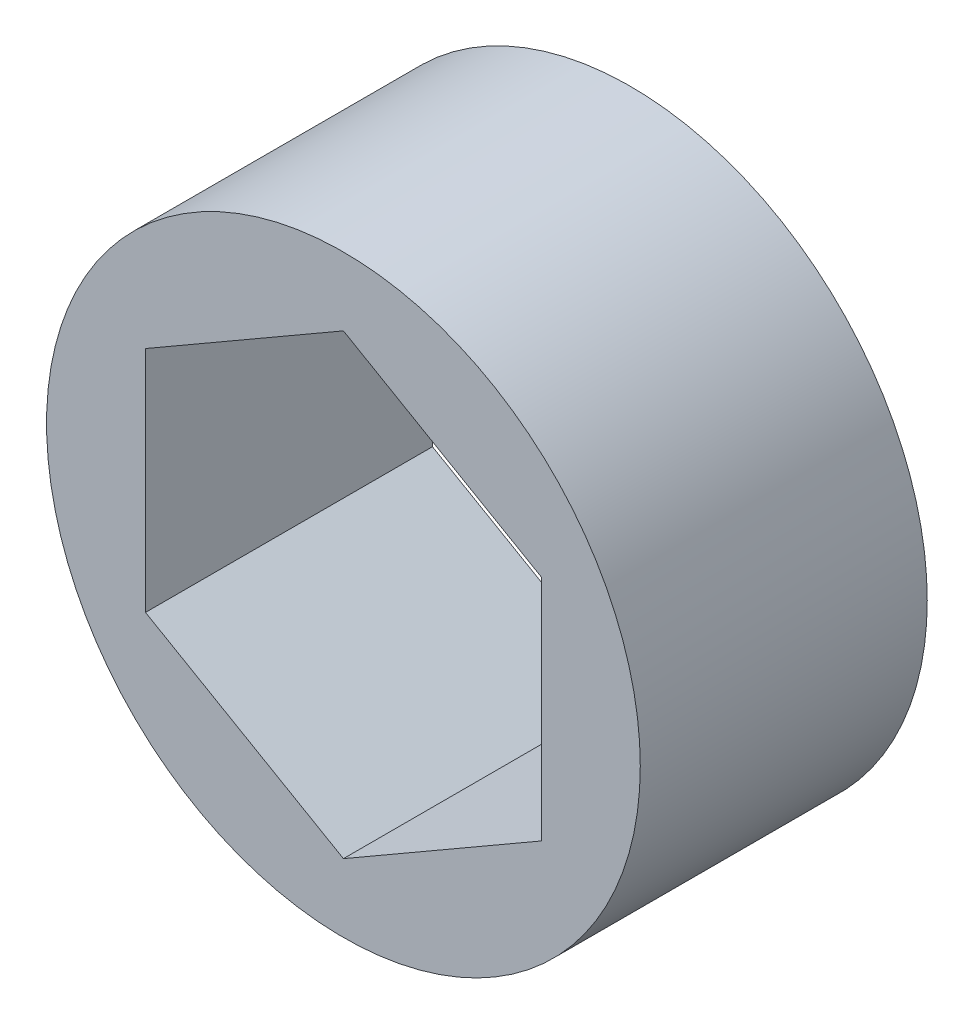
ISO-10303-21;
HEADER;
FILE_DESCRIPTION(('STEP AP214'),'2;1');
FILE_NAME('part.step','',(''),(''),'','','');
FILE_SCHEMA(('AUTOMOTIVE_DESIGN { 1 0 10303 214 1 1 1 1 }'));
ENDSEC;
DATA;
#1=APPLICATION_CONTEXT('core data for automotive mechanical design processes');
#2=APPLICATION_PROTOCOL_DEFINITION('international standard','automotive_design',2000,#1);
#3=PRODUCT_CONTEXT('',#1,'mechanical');
#4=PRODUCT('Part','Part','',(#3));
#5=PRODUCT_RELATED_PRODUCT_CATEGORY('part','',(#4));
#6=PRODUCT_DEFINITION_FORMATION('','',#4);
#7=PRODUCT_DEFINITION_CONTEXT('part definition',#1,'design');
#8=PRODUCT_DEFINITION('design','',#6,#7);
#9=PRODUCT_DEFINITION_SHAPE('','',#8);
#10=(LENGTH_UNIT() NAMED_UNIT(*) SI_UNIT(.MILLI.,.METRE.));
#11=(NAMED_UNIT(*) PLANE_ANGLE_UNIT() SI_UNIT($,.RADIAN.));
#12=(NAMED_UNIT(*) SI_UNIT($,.STERADIAN.) SOLID_ANGLE_UNIT());
#13=UNCERTAINTY_MEASURE_WITH_UNIT(LENGTH_MEASURE(1.E-05),#10,'distance_accuracy_value','');
#14=(GEOMETRIC_REPRESENTATION_CONTEXT(3) GLOBAL_UNCERTAINTY_ASSIGNED_CONTEXT((#13)) GLOBAL_UNIT_ASSIGNED_CONTEXT((#10,
#11,#12)) REPRESENTATION_CONTEXT('',''));
#15=CARTESIAN_POINT('',(0.,0.,0.));
#16=DIRECTION('',(0.,0.,1.));
#17=DIRECTION('',(1.,0.,0.));
#18=AXIS2_PLACEMENT_3D('',#15,#16,#17);
#19=CARTESIAN_POINT('',(0.,0.,9.2075));
#20=DIRECTION('',(0.,0.,1.));
#21=DIRECTION('',(1.,0.,0.));
#22=AXIS2_PLACEMENT_3D('',#19,#20,#21);
#23=PLANE('',#22);
#24=CARTESIAN_POINT('',(0.,0.,9.2075));
#25=DIRECTION('',(0.,0.,1.));
#26=DIRECTION('',(1.,0.,0.));
#27=AXIS2_PLACEMENT_3D('',#24,#25,#26);
#28=CIRCLE('',#27,9.525);
#29=CARTESIAN_POINT('',(9.525,0.,9.2075));
#30=VERTEX_POINT('',#29);
#31=EDGE_CURVE('E11',#30,#30,#28,.T.);
#32=ORIENTED_EDGE('',*,*,#31,.T.);
#33=EDGE_LOOP('',(#32));
#34=FACE_BOUND('',#33,.T.);
#35=DIRECTION('',(-0.866025403784439,0.5,0.));
#36=VECTOR('',#35,1.);
#37=CARTESIAN_POINT('',(6.35,3.66617420935412,9.2075));
#38=LINE('',#37,#36);
#39=CARTESIAN_POINT('',(6.35,3.66617420935412,9.2075));
#40=VERTEX_POINT('',#39);
#41=CARTESIAN_POINT('',(0.,7.33234841870825,9.2075));
#42=VERTEX_POINT('',#41);
#43=EDGE_CURVE('E108',#40,#42,#38,.T.);
#44=ORIENTED_EDGE('',*,*,#43,.F.);
#45=DIRECTION('',(0.,1.,0.));
#46=VECTOR('',#45,1.);
#47=CARTESIAN_POINT('',(6.35,-3.66617420935412,9.2075));
#48=LINE('',#47,#46);
#49=CARTESIAN_POINT('',(6.35,-3.66617420935412,9.2075));
#50=VERTEX_POINT('',#49);
#51=EDGE_CURVE('E99',#50,#40,#48,.T.);
#52=ORIENTED_EDGE('',*,*,#51,.F.);
#53=DIRECTION('',(0.866025403784438,0.5,0.));
#54=VECTOR('',#53,1.);
#55=CARTESIAN_POINT('',(0.,-7.33234841870825,9.2075));
#56=LINE('',#55,#54);
#57=CARTESIAN_POINT('',(0.,-7.33234841870825,9.2075));
#58=VERTEX_POINT('',#57);
#59=EDGE_CURVE('E133',#58,#50,#56,.T.);
#60=ORIENTED_EDGE('',*,*,#59,.F.);
#61=DIRECTION('',(0.866025403784439,-0.5,0.));
#62=VECTOR('',#61,1.);
#63=CARTESIAN_POINT('',(-6.35,-3.66617420935413,9.2075));
#64=LINE('',#63,#62);
#65=CARTESIAN_POINT('',(-6.35,-3.66617420935413,9.2075));
#66=VERTEX_POINT('',#65);
#67=EDGE_CURVE('E130',#66,#58,#64,.T.);
#68=ORIENTED_EDGE('',*,*,#67,.F.);
#69=DIRECTION('',(0.,-1.,0.));
#70=VECTOR('',#69,1.);
#71=CARTESIAN_POINT('',(-6.35,3.66617420935412,9.2075));
#72=LINE('',#71,#70);
#73=CARTESIAN_POINT('',(-6.35,3.66617420935412,9.2075));
#74=VERTEX_POINT('',#73);
#75=EDGE_CURVE('E125',#74,#66,#72,.T.);
#76=ORIENTED_EDGE('',*,*,#75,.F.);
#77=DIRECTION('',(-0.866025403784438,-0.5,0.));
#78=VECTOR('',#77,1.);
#79=CARTESIAN_POINT('',(0.,7.33234841870825,9.2075));
#80=LINE('',#79,#78);
#81=EDGE_CURVE('E121',#42,#74,#80,.T.);
#82=ORIENTED_EDGE('',*,*,#81,.F.);
#83=EDGE_LOOP('',(#44,#52,#60,#68,#76,#82));
#84=FACE_BOUND('',#83,.T.);
#85=ADVANCED_FACE('F45',(#34,#84),#23,.T.);
#86=CARTESIAN_POINT('',(0.,0.,0.));
#87=DIRECTION('',(0.,0.,1.));
#88=DIRECTION('',(1.,0.,0.));
#89=AXIS2_PLACEMENT_3D('',#86,#87,#88);
#90=PLANE('',#89);
#91=CARTESIAN_POINT('',(0.,0.,0.));
#92=DIRECTION('',(0.,0.,1.));
#93=DIRECTION('',(1.,0.,0.));
#94=AXIS2_PLACEMENT_3D('',#91,#92,#93);
#95=CIRCLE('',#94,9.525);
#96=CARTESIAN_POINT('',(9.525,0.,0.));
#97=VERTEX_POINT('',#96);
#98=EDGE_CURVE('E49',#97,#97,#95,.T.);
#99=ORIENTED_EDGE('',*,*,#98,.F.);
#100=EDGE_LOOP('',(#99));
#101=FACE_BOUND('',#100,.T.);
#102=DIRECTION('',(0.,1.,0.));
#103=VECTOR('',#102,1.);
#104=CARTESIAN_POINT('',(6.35,-3.66617420935412,0.));
#105=LINE('',#104,#103);
#106=CARTESIAN_POINT('',(6.35,-3.66617420935412,0.));
#107=VERTEX_POINT('',#106);
#108=CARTESIAN_POINT('',(6.35,3.66617420935412,0.));
#109=VERTEX_POINT('',#108);
#110=EDGE_CURVE('E69',#107,#109,#105,.T.);
#111=ORIENTED_EDGE('',*,*,#110,.T.);
#112=DIRECTION('',(-0.866025403784439,0.5,0.));
#113=VECTOR('',#112,1.);
#114=CARTESIAN_POINT('',(6.35,3.66617420935412,0.));
#115=LINE('',#114,#113);
#116=CARTESIAN_POINT('',(0.,7.33234841870825,0.));
#117=VERTEX_POINT('',#116);
#118=EDGE_CURVE('E115',#109,#117,#115,.T.);
#119=ORIENTED_EDGE('',*,*,#118,.T.);
#120=DIRECTION('',(-0.866025403784438,-0.5,0.));
#121=VECTOR('',#120,1.);
#122=CARTESIAN_POINT('',(0.,7.33234841870825,0.));
#123=LINE('',#122,#121);
#124=CARTESIAN_POINT('',(-6.35,3.66617420935412,0.));
#125=VERTEX_POINT('',#124);
#126=EDGE_CURVE('E140',#117,#125,#123,.T.);
#127=ORIENTED_EDGE('',*,*,#126,.T.);
#128=DIRECTION('',(0.,-1.,0.));
#129=VECTOR('',#128,1.);
#130=CARTESIAN_POINT('',(-6.35,3.66617420935412,0.));
#131=LINE('',#130,#129);
#132=CARTESIAN_POINT('',(-6.35,-3.66617420935413,0.));
#133=VERTEX_POINT('',#132);
#134=EDGE_CURVE('E144',#125,#133,#131,.T.);
#135=ORIENTED_EDGE('',*,*,#134,.T.);
#136=DIRECTION('',(0.866025403784439,-0.5,0.));
#137=VECTOR('',#136,1.);
#138=CARTESIAN_POINT('',(-6.35,-3.66617420935413,0.));
#139=LINE('',#138,#137);
#140=CARTESIAN_POINT('',(0.,-7.33234841870825,0.));
#141=VERTEX_POINT('',#140);
#142=EDGE_CURVE('E148',#133,#141,#139,.T.);
#143=ORIENTED_EDGE('',*,*,#142,.T.);
#144=DIRECTION('',(0.866025403784438,0.5,0.));
#145=VECTOR('',#144,1.);
#146=CARTESIAN_POINT('',(0.,-7.33234841870825,0.));
#147=LINE('',#146,#145);
#148=EDGE_CURVE('E109',#141,#107,#147,.T.);
#149=ORIENTED_EDGE('',*,*,#148,.T.);
#150=EDGE_LOOP('',(#111,#119,#127,#135,#143,#149));
#151=FACE_BOUND('',#150,.T.);
#152=ADVANCED_FACE('F172',(#101,#151),#90,.F.);
#153=CARTESIAN_POINT('',(0.,0.,9.2075));
#154=DIRECTION('',(0.,0.,-1.));
#155=DIRECTION('',(-1.,0.,0.));
#156=AXIS2_PLACEMENT_3D('',#153,#154,#155);
#157=CYLINDRICAL_SURFACE('',#156,9.525);
#158=ORIENTED_EDGE('',*,*,#31,.F.);
#159=EDGE_LOOP('',(#158));
#160=FACE_BOUND('',#159,.T.);
#161=ORIENTED_EDGE('',*,*,#98,.T.);
#162=EDGE_LOOP('',(#161));
#163=FACE_BOUND('',#162,.T.);
#164=ADVANCED_FACE('F47',(#160,#163),#157,.T.);
#165=CARTESIAN_POINT('',(6.35,-3.66617420935412,9.2075));
#166=DIRECTION('',(-1.,0.,0.));
#167=DIRECTION('',(0.,-1.,0.));
#168=AXIS2_PLACEMENT_3D('',#165,#166,#167);
#169=PLANE('',#168);
#170=ORIENTED_EDGE('',*,*,#110,.F.);
#171=DIRECTION('',(0.,0.,-1.));
#172=VECTOR('',#171,1.);
#173=CARTESIAN_POINT('',(6.35,-3.66617420935412,9.2075));
#174=LINE('',#173,#172);
#175=EDGE_CURVE('E103',#50,#107,#174,.T.);
#176=ORIENTED_EDGE('',*,*,#175,.F.);
#177=ORIENTED_EDGE('',*,*,#51,.T.);
#178=DIRECTION('',(0.,0.,-1.));
#179=VECTOR('',#178,1.);
#180=CARTESIAN_POINT('',(6.35,3.66617420935412,9.2075));
#181=LINE('',#180,#179);
#182=EDGE_CURVE('E102',#40,#109,#181,.T.);
#183=ORIENTED_EDGE('',*,*,#182,.T.);
#184=EDGE_LOOP('',(#170,#176,#177,#183));
#185=FACE_BOUND('',#184,.T.);
#186=ADVANCED_FACE('F101',(#185),#169,.T.);
#187=CARTESIAN_POINT('',(6.35,3.66617420935412,9.2075));
#188=DIRECTION('',(-0.5,-0.866025403784439,0.));
#189=DIRECTION('',(0.866025403784439,-0.5,0.));
#190=AXIS2_PLACEMENT_3D('',#187,#188,#189);
#191=PLANE('',#190);
#192=ORIENTED_EDGE('',*,*,#118,.F.);
#193=ORIENTED_EDGE('',*,*,#182,.F.);
#194=ORIENTED_EDGE('',*,*,#43,.T.);
#195=DIRECTION('',(0.,0.,-1.));
#196=VECTOR('',#195,1.);
#197=CARTESIAN_POINT('',(0.,7.33234841870825,9.2075));
#198=LINE('',#197,#196);
#199=EDGE_CURVE('E117',#42,#117,#198,.T.);
#200=ORIENTED_EDGE('',*,*,#199,.T.);
#201=EDGE_LOOP('',(#192,#193,#194,#200));
#202=FACE_BOUND('',#201,.T.);
#203=ADVANCED_FACE('F112',(#202),#191,.T.);
#204=CARTESIAN_POINT('',(0.,7.33234841870825,9.2075));
#205=DIRECTION('',(0.5,-0.866025403784438,0.));
#206=DIRECTION('',(0.866025403784438,0.5,0.));
#207=AXIS2_PLACEMENT_3D('',#204,#205,#206);
#208=PLANE('',#207);
#209=ORIENTED_EDGE('',*,*,#126,.F.);
#210=ORIENTED_EDGE('',*,*,#199,.F.);
#211=ORIENTED_EDGE('',*,*,#81,.T.);
#212=DIRECTION('',(0.,0.,-1.));
#213=VECTOR('',#212,1.);
#214=CARTESIAN_POINT('',(-6.35,3.66617420935412,9.2075));
#215=LINE('',#214,#213);
#216=EDGE_CURVE('E162',#74,#125,#215,.T.);
#217=ORIENTED_EDGE('',*,*,#216,.T.);
#218=EDGE_LOOP('',(#209,#210,#211,#217));
#219=FACE_BOUND('',#218,.T.);
#220=ADVANCED_FACE('F168',(#219),#208,.T.);
#221=CARTESIAN_POINT('',(-6.35,3.66617420935412,9.2075));
#222=DIRECTION('',(1.,0.,0.));
#223=DIRECTION('',(0.,0.,-1.));
#224=AXIS2_PLACEMENT_3D('',#221,#222,#223);
#225=PLANE('',#224);
#226=ORIENTED_EDGE('',*,*,#134,.F.);
#227=ORIENTED_EDGE('',*,*,#216,.F.);
#228=ORIENTED_EDGE('',*,*,#75,.T.);
#229=DIRECTION('',(0.,0.,-1.));
#230=VECTOR('',#229,1.);
#231=CARTESIAN_POINT('',(-6.35,-3.66617420935413,9.2075));
#232=LINE('',#231,#230);
#233=EDGE_CURVE('E159',#66,#133,#232,.T.);
#234=ORIENTED_EDGE('',*,*,#233,.T.);
#235=EDGE_LOOP('',(#226,#227,#228,#234));
#236=FACE_BOUND('',#235,.T.);
#237=ADVANCED_FACE('F180',(#236),#225,.T.);
#238=CARTESIAN_POINT('',(-6.35,-3.66617420935413,9.2075));
#239=DIRECTION('',(0.5,0.866025403784439,0.));
#240=DIRECTION('',(-0.866025403784439,0.5,0.));
#241=AXIS2_PLACEMENT_3D('',#238,#239,#240);
#242=PLANE('',#241);
#243=ORIENTED_EDGE('',*,*,#142,.F.);
#244=ORIENTED_EDGE('',*,*,#233,.F.);
#245=ORIENTED_EDGE('',*,*,#67,.T.);
#246=DIRECTION('',(0.,0.,-1.));
#247=VECTOR('',#246,1.);
#248=CARTESIAN_POINT('',(0.,-7.33234841870825,9.2075));
#249=LINE('',#248,#247);
#250=EDGE_CURVE('E61',#58,#141,#249,.T.);
#251=ORIENTED_EDGE('',*,*,#250,.T.);
#252=EDGE_LOOP('',(#243,#244,#245,#251));
#253=FACE_BOUND('',#252,.T.);
#254=ADVANCED_FACE('F178',(#253),#242,.T.);
#255=CARTESIAN_POINT('',(0.,-7.33234841870825,9.2075));
#256=DIRECTION('',(-0.5,0.866025403784438,0.));
#257=DIRECTION('',(-0.866025403784439,-0.5,0.));
#258=AXIS2_PLACEMENT_3D('',#255,#256,#257);
#259=PLANE('',#258);
#260=ORIENTED_EDGE('',*,*,#148,.F.);
#261=ORIENTED_EDGE('',*,*,#250,.F.);
#262=ORIENTED_EDGE('',*,*,#59,.T.);
#263=ORIENTED_EDGE('',*,*,#175,.T.);
#264=EDGE_LOOP('',(#260,#261,#262,#263));
#265=FACE_BOUND('',#264,.T.);
#266=ADVANCED_FACE('F174',(#265),#259,.T.);
#267=CLOSED_SHELL('',(#85,#152,#164,#186,#203,#220,#237,#254,#266));
#268=MANIFOLD_SOLID_BREP('B2',#267);
#269=ADVANCED_BREP_SHAPE_REPRESENTATION('',(#18,#268),#14);
#270=SHAPE_DEFINITION_REPRESENTATION(#9,#269);
ENDSEC;
END-ISO-10303-21;
